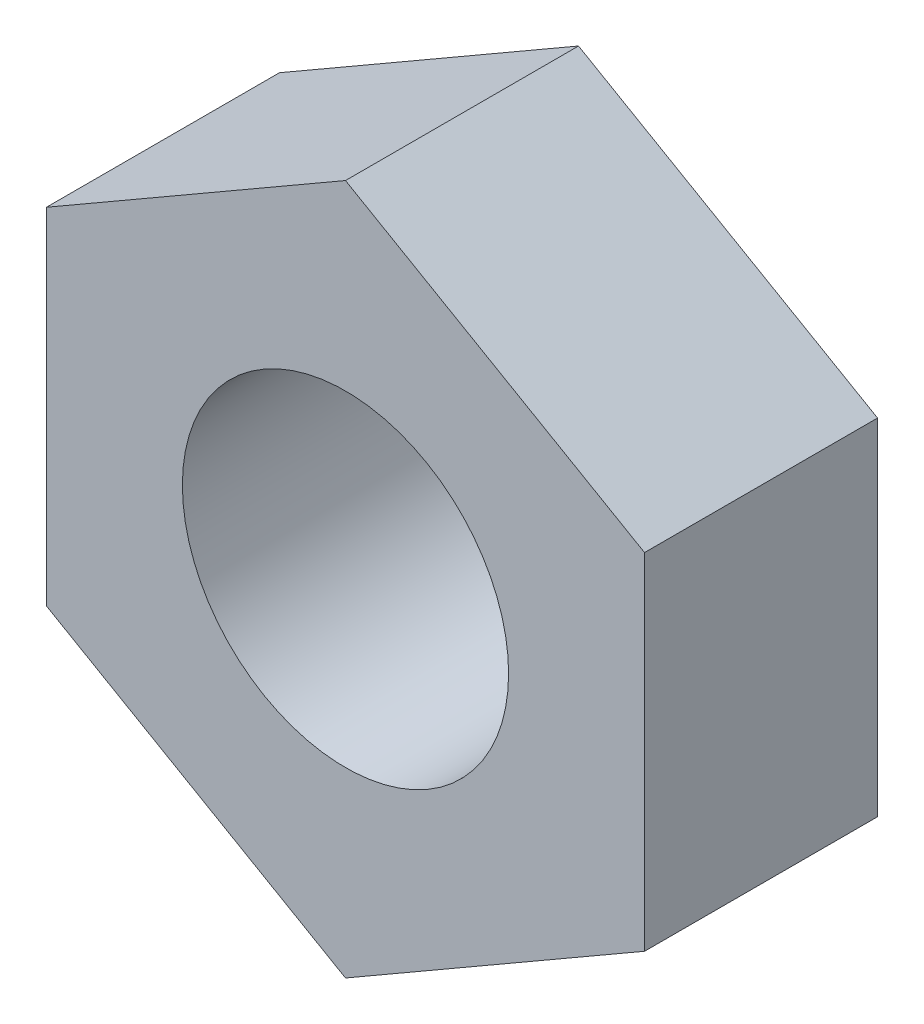
ISO-10303-21;
HEADER;
FILE_DESCRIPTION(('STEP AP214'),'2;1');
FILE_NAME('part.step','',(''),(''),'','','');
FILE_SCHEMA(('AUTOMOTIVE_DESIGN { 1 0 10303 214 1 1 1 1 }'));
ENDSEC;
DATA;
#1=APPLICATION_CONTEXT('core data for automotive mechanical design processes');
#2=APPLICATION_PROTOCOL_DEFINITION('international standard','automotive_design',2000,#1);
#3=PRODUCT_CONTEXT('',#1,'mechanical');
#4=PRODUCT('Part','Part','',(#3));
#5=PRODUCT_RELATED_PRODUCT_CATEGORY('part','',(#4));
#6=PRODUCT_DEFINITION_FORMATION('','',#4);
#7=PRODUCT_DEFINITION_CONTEXT('part definition',#1,'design');
#8=PRODUCT_DEFINITION('design','',#6,#7);
#9=PRODUCT_DEFINITION_SHAPE('','',#8);
#10=(LENGTH_UNIT() NAMED_UNIT(*) SI_UNIT(.MILLI.,.METRE.));
#11=(NAMED_UNIT(*) PLANE_ANGLE_UNIT() SI_UNIT($,.RADIAN.));
#12=(NAMED_UNIT(*) SI_UNIT($,.STERADIAN.) SOLID_ANGLE_UNIT());
#13=UNCERTAINTY_MEASURE_WITH_UNIT(LENGTH_MEASURE(1.E-05),#10,'distance_accuracy_value','');
#14=(GEOMETRIC_REPRESENTATION_CONTEXT(3) GLOBAL_UNCERTAINTY_ASSIGNED_CONTEXT((#13)) GLOBAL_UNIT_ASSIGNED_CONTEXT((#10,
#11,#12)) REPRESENTATION_CONTEXT('',''));
#15=CARTESIAN_POINT('',(0.,0.,0.));
#16=DIRECTION('',(0.,0.,1.));
#17=DIRECTION('',(1.,0.,0.));
#18=AXIS2_PLACEMENT_3D('',#15,#16,#17);
#19=CARTESIAN_POINT('',(-3.85,-2.22279853638006,3.));
#20=DIRECTION('',(0.5,0.866025403784439,0.));
#21=DIRECTION('',(-0.866025403784439,0.5,0.));
#22=AXIS2_PLACEMENT_3D('',#19,#20,#21);
#23=PLANE('',#22);
#24=DIRECTION('',(0.866025403784439,-0.5,0.));
#25=VECTOR('',#24,1.);
#26=CARTESIAN_POINT('',(-3.85,-2.22279853638006,0.));
#27=LINE('',#26,#25);
#28=CARTESIAN_POINT('',(-3.85,-2.22279853638006,0.));
#29=VERTEX_POINT('',#28);
#30=CARTESIAN_POINT('',(0.,-4.44559707276012,0.));
#31=VERTEX_POINT('',#30);
#32=EDGE_CURVE('E125',#29,#31,#27,.T.);
#33=ORIENTED_EDGE('',*,*,#32,.T.);
#34=DIRECTION('',(0.,0.,-1.));
#35=VECTOR('',#34,1.);
#36=CARTESIAN_POINT('',(0.,-4.44559707276012,3.));
#37=LINE('',#36,#35);
#38=CARTESIAN_POINT('',(0.,-4.44559707276012,3.));
#39=VERTEX_POINT('',#38);
#40=EDGE_CURVE('E11',#39,#31,#37,.T.);
#41=ORIENTED_EDGE('',*,*,#40,.F.);
#42=DIRECTION('',(0.866025403784439,-0.5,0.));
#43=VECTOR('',#42,1.);
#44=CARTESIAN_POINT('',(-3.85,-2.22279853638006,3.));
#45=LINE('',#44,#43);
#46=CARTESIAN_POINT('',(-3.85,-2.22279853638006,3.));
#47=VERTEX_POINT('',#46);
#48=EDGE_CURVE('E136',#47,#39,#45,.T.);
#49=ORIENTED_EDGE('',*,*,#48,.F.);
#50=DIRECTION('',(0.,0.,-1.));
#51=VECTOR('',#50,1.);
#52=CARTESIAN_POINT('',(-3.85,-2.22279853638006,3.));
#53=LINE('',#52,#51);
#54=EDGE_CURVE('E121',#47,#29,#53,.T.);
#55=ORIENTED_EDGE('',*,*,#54,.T.);
#56=EDGE_LOOP('',(#33,#41,#49,#55));
#57=FACE_BOUND('',#56,.T.);
#58=ADVANCED_FACE('F41',(#57),#23,.F.);
#59=CARTESIAN_POINT('',(0.,-4.44559707276012,3.));
#60=DIRECTION('',(-0.5,0.866025403784439,0.));
#61=DIRECTION('',(-0.866025403784439,-0.5,0.));
#62=AXIS2_PLACEMENT_3D('',#59,#60,#61);
#63=PLANE('',#62);
#64=DIRECTION('',(0.866025403784439,0.5,0.));
#65=VECTOR('',#64,1.);
#66=CARTESIAN_POINT('',(0.,-4.44559707276012,0.));
#67=LINE('',#66,#65);
#68=CARTESIAN_POINT('',(3.85,-2.22279853638006,0.));
#69=VERTEX_POINT('',#68);
#70=EDGE_CURVE('E128',#31,#69,#67,.T.);
#71=ORIENTED_EDGE('',*,*,#70,.T.);
#72=DIRECTION('',(0.,0.,-1.));
#73=VECTOR('',#72,1.);
#74=CARTESIAN_POINT('',(3.85,-2.22279853638006,3.));
#75=LINE('',#74,#73);
#76=CARTESIAN_POINT('',(3.85,-2.22279853638006,3.));
#77=VERTEX_POINT('',#76);
#78=EDGE_CURVE('E49',#77,#69,#75,.T.);
#79=ORIENTED_EDGE('',*,*,#78,.F.);
#80=DIRECTION('',(0.866025403784439,0.5,0.));
#81=VECTOR('',#80,1.);
#82=CARTESIAN_POINT('',(0.,-4.44559707276012,3.));
#83=LINE('',#82,#81);
#84=EDGE_CURVE('E94',#39,#77,#83,.T.);
#85=ORIENTED_EDGE('',*,*,#84,.F.);
#86=ORIENTED_EDGE('',*,*,#40,.T.);
#87=EDGE_LOOP('',(#71,#79,#85,#86));
#88=FACE_BOUND('',#87,.T.);
#89=ADVANCED_FACE('F161',(#88),#63,.F.);
#90=CARTESIAN_POINT('',(3.85,-2.22279853638006,3.));
#91=DIRECTION('',(-1.,0.,0.));
#92=DIRECTION('',(0.,-1.,0.));
#93=AXIS2_PLACEMENT_3D('',#90,#91,#92);
#94=PLANE('',#93);
#95=DIRECTION('',(0.,1.,0.));
#96=VECTOR('',#95,1.);
#97=CARTESIAN_POINT('',(3.85,-2.22279853638006,0.));
#98=LINE('',#97,#96);
#99=CARTESIAN_POINT('',(3.85,2.22279853638006,0.));
#100=VERTEX_POINT('',#99);
#101=EDGE_CURVE('E131',#69,#100,#98,.T.);
#102=ORIENTED_EDGE('',*,*,#101,.T.);
#103=DIRECTION('',(0.,0.,-1.));
#104=VECTOR('',#103,1.);
#105=CARTESIAN_POINT('',(3.85,2.22279853638006,3.));
#106=LINE('',#105,#104);
#107=CARTESIAN_POINT('',(3.85,2.22279853638006,3.));
#108=VERTEX_POINT('',#107);
#109=EDGE_CURVE('E116',#108,#100,#106,.T.);
#110=ORIENTED_EDGE('',*,*,#109,.F.);
#111=DIRECTION('',(0.,1.,0.));
#112=VECTOR('',#111,1.);
#113=CARTESIAN_POINT('',(3.85,-2.22279853638006,3.));
#114=LINE('',#113,#112);
#115=EDGE_CURVE('E107',#77,#108,#114,.T.);
#116=ORIENTED_EDGE('',*,*,#115,.F.);
#117=ORIENTED_EDGE('',*,*,#78,.T.);
#118=EDGE_LOOP('',(#102,#110,#116,#117));
#119=FACE_BOUND('',#118,.T.);
#120=ADVANCED_FACE('F142',(#119),#94,.F.);
#121=CARTESIAN_POINT('',(3.85,2.22279853638006,3.));
#122=DIRECTION('',(-0.5,-0.866025403784439,0.));
#123=DIRECTION('',(0.866025403784439,-0.5,0.));
#124=AXIS2_PLACEMENT_3D('',#121,#122,#123);
#125=PLANE('',#124);
#126=DIRECTION('',(-0.866025403784439,0.5,0.));
#127=VECTOR('',#126,1.);
#128=CARTESIAN_POINT('',(3.85,2.22279853638006,0.));
#129=LINE('',#128,#127);
#130=CARTESIAN_POINT('',(0.,4.44559707276012,0.));
#131=VERTEX_POINT('',#130);
#132=EDGE_CURVE('E115',#100,#131,#129,.T.);
#133=ORIENTED_EDGE('',*,*,#132,.T.);
#134=DIRECTION('',(0.,0.,-1.));
#135=VECTOR('',#134,1.);
#136=CARTESIAN_POINT('',(0.,4.44559707276012,3.));
#137=LINE('',#136,#135);
#138=CARTESIAN_POINT('',(0.,4.44559707276012,3.));
#139=VERTEX_POINT('',#138);
#140=EDGE_CURVE('E112',#139,#131,#137,.T.);
#141=ORIENTED_EDGE('',*,*,#140,.F.);
#142=DIRECTION('',(-0.866025403784439,0.5,0.));
#143=VECTOR('',#142,1.);
#144=CARTESIAN_POINT('',(3.85,2.22279853638006,3.));
#145=LINE('',#144,#143);
#146=EDGE_CURVE('E101',#108,#139,#145,.T.);
#147=ORIENTED_EDGE('',*,*,#146,.F.);
#148=ORIENTED_EDGE('',*,*,#109,.T.);
#149=EDGE_LOOP('',(#133,#141,#147,#148));
#150=FACE_BOUND('',#149,.T.);
#151=ADVANCED_FACE('F113',(#150),#125,.F.);
#152=CARTESIAN_POINT('',(0.,4.44559707276012,3.));
#153=DIRECTION('',(0.5,-0.866025403784439,0.));
#154=DIRECTION('',(0.866025403784439,0.5,0.));
#155=AXIS2_PLACEMENT_3D('',#152,#153,#154);
#156=PLANE('',#155);
#157=DIRECTION('',(-0.866025403784439,-0.5,0.));
#158=VECTOR('',#157,1.);
#159=CARTESIAN_POINT('',(0.,4.44559707276012,0.));
#160=LINE('',#159,#158);
#161=CARTESIAN_POINT('',(-3.85,2.22279853638006,0.));
#162=VERTEX_POINT('',#161);
#163=EDGE_CURVE('E80',#131,#162,#160,.T.);
#164=ORIENTED_EDGE('',*,*,#163,.T.);
#165=DIRECTION('',(0.,0.,-1.));
#166=VECTOR('',#165,1.);
#167=CARTESIAN_POINT('',(-3.85,2.22279853638006,3.));
#168=LINE('',#167,#166);
#169=CARTESIAN_POINT('',(-3.85,2.22279853638006,3.));
#170=VERTEX_POINT('',#169);
#171=EDGE_CURVE('E117',#170,#162,#168,.T.);
#172=ORIENTED_EDGE('',*,*,#171,.F.);
#173=DIRECTION('',(-0.866025403784439,-0.5,0.));
#174=VECTOR('',#173,1.);
#175=CARTESIAN_POINT('',(0.,4.44559707276012,3.));
#176=LINE('',#175,#174);
#177=EDGE_CURVE('E105',#139,#170,#176,.T.);
#178=ORIENTED_EDGE('',*,*,#177,.F.);
#179=ORIENTED_EDGE('',*,*,#140,.T.);
#180=EDGE_LOOP('',(#164,#172,#178,#179));
#181=FACE_BOUND('',#180,.T.);
#182=ADVANCED_FACE('F119',(#181),#156,.F.);
#183=CARTESIAN_POINT('',(-3.85,2.22279853638006,3.));
#184=DIRECTION('',(1.,0.,0.));
#185=DIRECTION('',(0.,1.,0.));
#186=AXIS2_PLACEMENT_3D('',#183,#184,#185);
#187=PLANE('',#186);
#188=DIRECTION('',(0.,-1.,0.));
#189=VECTOR('',#188,1.);
#190=CARTESIAN_POINT('',(-3.85,2.22279853638006,0.));
#191=LINE('',#190,#189);
#192=EDGE_CURVE('E86',#162,#29,#191,.T.);
#193=ORIENTED_EDGE('',*,*,#192,.T.);
#194=ORIENTED_EDGE('',*,*,#54,.F.);
#195=DIRECTION('',(0.,-1.,0.));
#196=VECTOR('',#195,1.);
#197=CARTESIAN_POINT('',(-3.85,2.22279853638006,3.));
#198=LINE('',#197,#196);
#199=EDGE_CURVE('E57',#170,#47,#198,.T.);
#200=ORIENTED_EDGE('',*,*,#199,.F.);
#201=ORIENTED_EDGE('',*,*,#171,.T.);
#202=EDGE_LOOP('',(#193,#194,#200,#201));
#203=FACE_BOUND('',#202,.T.);
#204=ADVANCED_FACE('F149',(#203),#187,.F.);
#205=CARTESIAN_POINT('',(0.,0.,3.));
#206=DIRECTION('',(0.,0.,1.));
#207=DIRECTION('',(1.,0.,0.));
#208=AXIS2_PLACEMENT_3D('',#205,#206,#207);
#209=PLANE('',#208);
#210=CARTESIAN_POINT('',(0.,0.,3.));
#211=DIRECTION('',(0.,0.,1.));
#212=DIRECTION('',(1.,0.,0.));
#213=AXIS2_PLACEMENT_3D('',#210,#211,#212);
#214=CIRCLE('',#213,2.1);
#215=CARTESIAN_POINT('',(2.1,0.,3.));
#216=VERTEX_POINT('',#215);
#217=EDGE_CURVE('E217',#216,#216,#214,.T.);
#218=ORIENTED_EDGE('',*,*,#217,.F.);
#219=EDGE_LOOP('',(#218));
#220=FACE_BOUND('',#219,.T.);
#221=ORIENTED_EDGE('',*,*,#48,.T.);
#222=ORIENTED_EDGE('',*,*,#84,.T.);
#223=ORIENTED_EDGE('',*,*,#115,.T.);
#224=ORIENTED_EDGE('',*,*,#146,.T.);
#225=ORIENTED_EDGE('',*,*,#177,.T.);
#226=ORIENTED_EDGE('',*,*,#199,.T.);
#227=EDGE_LOOP('',(#221,#222,#223,#224,#225,#226));
#228=FACE_BOUND('',#227,.T.);
#229=ADVANCED_FACE('F103',(#220,#228),#209,.T.);
#230=CARTESIAN_POINT('',(0.,0.,0.));
#231=DIRECTION('',(0.,0.,1.));
#232=DIRECTION('',(1.,0.,0.));
#233=AXIS2_PLACEMENT_3D('',#230,#231,#232);
#234=PLANE('',#233);
#235=CARTESIAN_POINT('',(0.,0.,0.));
#236=DIRECTION('',(0.,0.,1.));
#237=DIRECTION('',(1.,0.,0.));
#238=AXIS2_PLACEMENT_3D('',#235,#236,#237);
#239=CIRCLE('',#238,2.1);
#240=CARTESIAN_POINT('',(2.1,0.,0.));
#241=VERTEX_POINT('',#240);
#242=EDGE_CURVE('E129',#241,#241,#239,.T.);
#243=ORIENTED_EDGE('',*,*,#242,.T.);
#244=EDGE_LOOP('',(#243));
#245=FACE_BOUND('',#244,.T.);
#246=ORIENTED_EDGE('',*,*,#32,.F.);
#247=ORIENTED_EDGE('',*,*,#192,.F.);
#248=ORIENTED_EDGE('',*,*,#163,.F.);
#249=ORIENTED_EDGE('',*,*,#132,.F.);
#250=ORIENTED_EDGE('',*,*,#101,.F.);
#251=ORIENTED_EDGE('',*,*,#70,.F.);
#252=EDGE_LOOP('',(#246,#247,#248,#249,#250,#251));
#253=FACE_BOUND('',#252,.T.);
#254=ADVANCED_FACE('F145',(#245,#253),#234,.F.);
#255=CARTESIAN_POINT('',(0.,0.,3.));
#256=DIRECTION('',(0.,0.,1.));
#257=DIRECTION('',(1.,0.,0.));
#258=AXIS2_PLACEMENT_3D('',#255,#256,#257);
#259=CYLINDRICAL_SURFACE('',#258,2.1);
#260=ORIENTED_EDGE('',*,*,#242,.F.);
#261=EDGE_LOOP('',(#260));
#262=FACE_BOUND('',#261,.T.);
#263=ORIENTED_EDGE('',*,*,#217,.T.);
#264=EDGE_LOOP('',(#263));
#265=FACE_BOUND('',#264,.T.);
#266=ADVANCED_FACE('F200',(#262,#265),#259,.F.);
#267=CLOSED_SHELL('',(#58,#89,#120,#151,#182,#204,#229,#254,#266));
#268=MANIFOLD_SOLID_BREP('B2',#267);
#269=ADVANCED_BREP_SHAPE_REPRESENTATION('',(#18,#268),#14);
#270=SHAPE_DEFINITION_REPRESENTATION(#9,#269);
ENDSEC;
END-ISO-10303-21;
